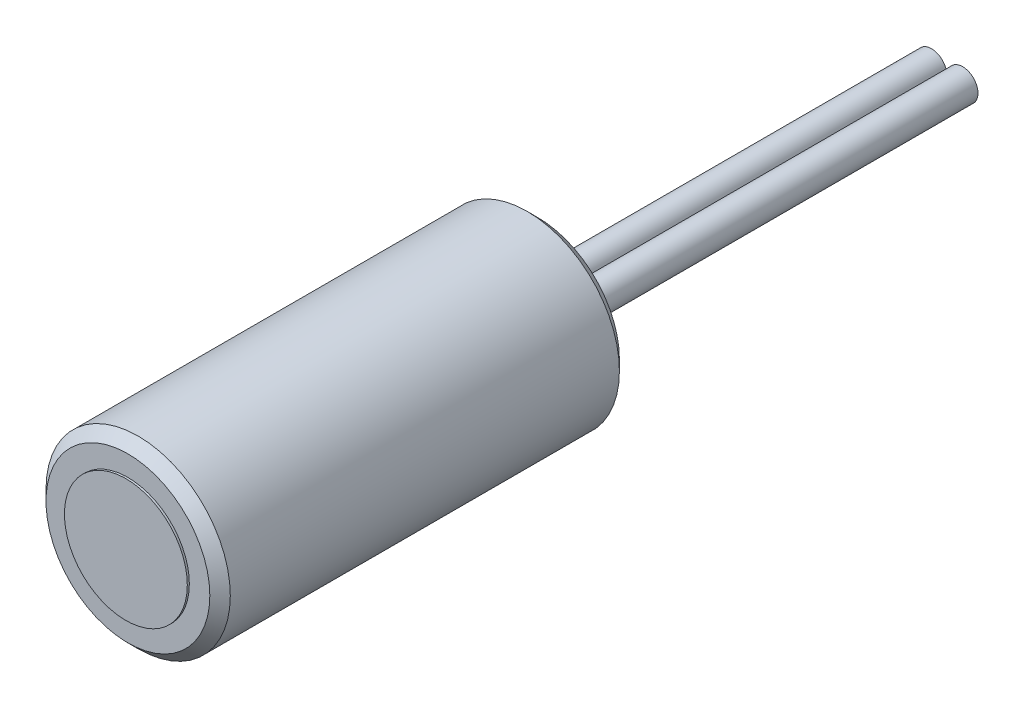
ISO-10303-21;
HEADER;
FILE_DESCRIPTION(('STEP AP214'),'2;1');
FILE_NAME('part.step','',(''),(''),'','','');
FILE_SCHEMA(('AUTOMOTIVE_DESIGN { 1 0 10303 214 1 1 1 1 }'));
ENDSEC;
DATA;
#1=APPLICATION_CONTEXT('core data for automotive mechanical design processes');
#2=APPLICATION_PROTOCOL_DEFINITION('international standard','automotive_design',2000,#1);
#3=PRODUCT_CONTEXT('',#1,'mechanical');
#4=PRODUCT('Part','Part','',(#3));
#5=PRODUCT_RELATED_PRODUCT_CATEGORY('part','',(#4));
#6=PRODUCT_DEFINITION_FORMATION('','',#4);
#7=PRODUCT_DEFINITION_CONTEXT('part definition',#1,'design');
#8=PRODUCT_DEFINITION('design','',#6,#7);
#9=PRODUCT_DEFINITION_SHAPE('','',#8);
#10=(LENGTH_UNIT() NAMED_UNIT(*) SI_UNIT(.MILLI.,.METRE.));
#11=(NAMED_UNIT(*) PLANE_ANGLE_UNIT() SI_UNIT($,.RADIAN.));
#12=(NAMED_UNIT(*) SI_UNIT($,.STERADIAN.) SOLID_ANGLE_UNIT());
#13=UNCERTAINTY_MEASURE_WITH_UNIT(LENGTH_MEASURE(1.E-05),#10,'distance_accuracy_value','');
#14=(GEOMETRIC_REPRESENTATION_CONTEXT(3) GLOBAL_UNCERTAINTY_ASSIGNED_CONTEXT((#13)) GLOBAL_UNIT_ASSIGNED_CONTEXT((#10,
#11,#12)) REPRESENTATION_CONTEXT('',''));
#15=CARTESIAN_POINT('',(0.,0.,0.));
#16=DIRECTION('',(0.,0.,1.));
#17=DIRECTION('',(1.,0.,0.));
#18=AXIS2_PLACEMENT_3D('',#15,#16,#17);
#19=CARTESIAN_POINT('',(0.,0.,0.));
#20=DIRECTION('',(0.,0.,1.));
#21=DIRECTION('',(1.,0.,0.));
#22=AXIS2_PLACEMENT_3D('',#19,#20,#21);
#23=PLANE('',#22);
#24=CARTESIAN_POINT('',(-0.76,0.,0.));
#25=DIRECTION('',(0.,0.,1.));
#26=DIRECTION('',(1.,0.,0.));
#27=AXIS2_PLACEMENT_3D('',#24,#25,#26);
#28=CIRCLE('',#27,0.75);
#29=CARTESIAN_POINT('',(-0.00999999999999992,0.,0.));
#30=VERTEX_POINT('',#29);
#31=EDGE_CURVE('E38',#30,#30,#28,.F.);
#32=ORIENTED_EDGE('',*,*,#31,.F.);
#33=EDGE_LOOP('',(#32));
#34=FACE_BOUND('',#33,.T.);
#35=CARTESIAN_POINT('',(0.,0.,0.));
#36=DIRECTION('',(0.,0.,1.));
#37=DIRECTION('',(1.,0.,0.));
#38=AXIS2_PLACEMENT_3D('',#35,#36,#37);
#39=CIRCLE('',#38,4.);
#40=CARTESIAN_POINT('',(4.,0.,0.));
#41=VERTEX_POINT('',#40);
#42=EDGE_CURVE('E46',#41,#41,#39,.F.);
#43=ORIENTED_EDGE('',*,*,#42,.T.);
#44=EDGE_LOOP('',(#43));
#45=FACE_BOUND('',#44,.T.);
#46=CARTESIAN_POINT('',(0.76,0.,0.));
#47=DIRECTION('',(0.,0.,1.));
#48=DIRECTION('',(1.,0.,0.));
#49=AXIS2_PLACEMENT_3D('',#46,#47,#48);
#50=CIRCLE('',#49,0.75);
#51=CARTESIAN_POINT('',(1.51,0.,0.));
#52=VERTEX_POINT('',#51);
#53=EDGE_CURVE('E10',#52,#52,#50,.F.);
#54=ORIENTED_EDGE('',*,*,#53,.F.);
#55=EDGE_LOOP('',(#54));
#56=FACE_BOUND('',#55,.T.);
#57=ADVANCED_FACE('F31',(#34,#45,#56),#23,.F.);
#58=CARTESIAN_POINT('',(0.,0.,20.));
#59=DIRECTION('',(0.,0.,1.));
#60=DIRECTION('',(1.,0.,0.));
#61=AXIS2_PLACEMENT_3D('',#58,#59,#60);
#62=PLANE('',#61);
#63=CARTESIAN_POINT('',(0.,0.,20.));
#64=DIRECTION('',(0.,0.,1.));
#65=DIRECTION('',(1.,0.,0.));
#66=AXIS2_PLACEMENT_3D('',#63,#64,#65);
#67=CIRCLE('',#66,4.);
#68=CARTESIAN_POINT('',(4.,0.,20.));
#69=VERTEX_POINT('',#68);
#70=EDGE_CURVE('E42',#69,#69,#67,.T.);
#71=ORIENTED_EDGE('',*,*,#70,.T.);
#72=EDGE_LOOP('',(#71));
#73=FACE_BOUND('',#72,.T.);
#74=CARTESIAN_POINT('',(0.,0.,20.));
#75=DIRECTION('',(0.,0.,1.));
#76=DIRECTION('',(1.,0.,0.));
#77=AXIS2_PLACEMENT_3D('',#74,#75,#76);
#78=CIRCLE('',#77,3.);
#79=CARTESIAN_POINT('',(3.,0.,20.));
#80=VERTEX_POINT('',#79);
#81=EDGE_CURVE('E58',#80,#80,#78,.T.);
#82=ORIENTED_EDGE('',*,*,#81,.F.);
#83=EDGE_LOOP('',(#82));
#84=FACE_BOUND('',#83,.T.);
#85=ADVANCED_FACE('F85',(#73,#84),#62,.T.);
#86=CARTESIAN_POINT('',(0.,0.,20.));
#87=DIRECTION('',(0.,0.,-1.));
#88=DIRECTION('',(-1.,0.,0.));
#89=AXIS2_PLACEMENT_3D('',#86,#87,#88);
#90=CYLINDRICAL_SURFACE('',#89,4.5);
#91=CARTESIAN_POINT('',(0.,0.,0.5));
#92=DIRECTION('',(0.,0.,1.));
#93=DIRECTION('',(1.,0.,0.));
#94=AXIS2_PLACEMENT_3D('',#91,#92,#93);
#95=CIRCLE('',#94,4.5);
#96=CARTESIAN_POINT('',(4.5,0.,0.5));
#97=VERTEX_POINT('',#96);
#98=EDGE_CURVE('E51',#97,#97,#95,.T.);
#99=ORIENTED_EDGE('',*,*,#98,.T.);
#100=EDGE_LOOP('',(#99));
#101=FACE_BOUND('',#100,.T.);
#102=CARTESIAN_POINT('',(0.,0.,19.5));
#103=DIRECTION('',(0.,0.,1.));
#104=DIRECTION('',(1.,0.,0.));
#105=AXIS2_PLACEMENT_3D('',#102,#103,#104);
#106=CIRCLE('',#105,4.5);
#107=CARTESIAN_POINT('',(4.5,0.,19.5));
#108=VERTEX_POINT('',#107);
#109=EDGE_CURVE('E54',#108,#108,#106,.F.);
#110=ORIENTED_EDGE('',*,*,#109,.T.);
#111=EDGE_LOOP('',(#110));
#112=FACE_BOUND('',#111,.T.);
#113=ADVANCED_FACE('F93',(#101,#112),#90,.T.);
#114=CARTESIAN_POINT('',(0.,0.,0.5));
#115=DIRECTION('',(0.,0.,1.));
#116=DIRECTION('',(1.,0.,0.));
#117=AXIS2_PLACEMENT_3D('',#114,#115,#116);
#118=CONICAL_SURFACE('',#117,4.5,0.785398163397449);
#119=ORIENTED_EDGE('',*,*,#42,.F.);
#120=EDGE_LOOP('',(#119));
#121=FACE_BOUND('',#120,.T.);
#122=ORIENTED_EDGE('',*,*,#98,.F.);
#123=EDGE_LOOP('',(#122));
#124=FACE_BOUND('',#123,.T.);
#125=ADVANCED_FACE('F100',(#121,#124),#118,.T.);
#126=CARTESIAN_POINT('',(0.,0.,20.));
#127=DIRECTION('',(0.,0.,-1.));
#128=DIRECTION('',(-1.,0.,0.));
#129=AXIS2_PLACEMENT_3D('',#126,#127,#128);
#130=CONICAL_SURFACE('',#129,4.,0.785398163397444);
#131=ORIENTED_EDGE('',*,*,#109,.F.);
#132=EDGE_LOOP('',(#131));
#133=FACE_BOUND('',#132,.T.);
#134=ORIENTED_EDGE('',*,*,#70,.F.);
#135=EDGE_LOOP('',(#134));
#136=FACE_BOUND('',#135,.T.);
#137=ADVANCED_FACE('F33',(#133,#136),#130,.T.);
#138=CARTESIAN_POINT('',(0.,0.,20.1));
#139=DIRECTION('',(0.,0.,-1.));
#140=DIRECTION('',(-1.,0.,0.));
#141=AXIS2_PLACEMENT_3D('',#138,#139,#140);
#142=CYLINDRICAL_SURFACE('',#141,3.);
#143=CARTESIAN_POINT('',(0.,0.,20.1));
#144=DIRECTION('',(0.,0.,1.));
#145=DIRECTION('',(1.,0.,0.));
#146=AXIS2_PLACEMENT_3D('',#143,#144,#145);
#147=CIRCLE('',#146,3.);
#148=CARTESIAN_POINT('',(3.,0.,20.1));
#149=VERTEX_POINT('',#148);
#150=EDGE_CURVE('E57',#149,#149,#147,.T.);
#151=ORIENTED_EDGE('',*,*,#150,.F.);
#152=EDGE_LOOP('',(#151));
#153=FACE_BOUND('',#152,.T.);
#154=ORIENTED_EDGE('',*,*,#81,.T.);
#155=EDGE_LOOP('',(#154));
#156=FACE_BOUND('',#155,.T.);
#157=ADVANCED_FACE('F107',(#153,#156),#142,.T.);
#158=CARTESIAN_POINT('',(0.,0.,20.1));
#159=DIRECTION('',(0.,0.,1.));
#160=DIRECTION('',(1.,0.,0.));
#161=AXIS2_PLACEMENT_3D('',#158,#159,#160);
#162=PLANE('',#161);
#163=ORIENTED_EDGE('',*,*,#150,.T.);
#164=EDGE_LOOP('',(#163));
#165=FACE_BOUND('',#164,.T.);
#166=ADVANCED_FACE('F120',(#165),#162,.T.);
#167=CARTESIAN_POINT('',(-0.76,0.,-20.));
#168=DIRECTION('',(0.,0.,1.));
#169=DIRECTION('',(1.,0.,0.));
#170=AXIS2_PLACEMENT_3D('',#167,#168,#169);
#171=CYLINDRICAL_SURFACE('',#170,0.75);
#172=CARTESIAN_POINT('',(-0.76,0.,-20.));
#173=DIRECTION('',(0.,0.,-1.));
#174=DIRECTION('',(-1.,0.,0.));
#175=AXIS2_PLACEMENT_3D('',#172,#173,#174);
#176=CIRCLE('',#175,0.75);
#177=CARTESIAN_POINT('',(-1.51,0.,-20.));
#178=VERTEX_POINT('',#177);
#179=EDGE_CURVE('E61',#178,#178,#176,.T.);
#180=ORIENTED_EDGE('',*,*,#179,.F.);
#181=EDGE_LOOP('',(#180));
#182=FACE_BOUND('',#181,.T.);
#183=ORIENTED_EDGE('',*,*,#31,.T.);
#184=EDGE_LOOP('',(#183));
#185=FACE_BOUND('',#184,.T.);
#186=ADVANCED_FACE('F81',(#182,#185),#171,.T.);
#187=CARTESIAN_POINT('',(-0.76,0.,-20.));
#188=DIRECTION('',(0.,0.,-1.));
#189=DIRECTION('',(-1.,0.,0.));
#190=AXIS2_PLACEMENT_3D('',#187,#188,#189);
#191=PLANE('',#190);
#192=ORIENTED_EDGE('',*,*,#179,.T.);
#193=EDGE_LOOP('',(#192));
#194=FACE_BOUND('',#193,.T.);
#195=ADVANCED_FACE('F74',(#194),#191,.T.);
#196=CARTESIAN_POINT('',(0.76,0.,-20.));
#197=DIRECTION('',(0.,0.,1.));
#198=DIRECTION('',(1.,0.,0.));
#199=AXIS2_PLACEMENT_3D('',#196,#197,#198);
#200=CYLINDRICAL_SURFACE('',#199,0.75);
#201=CARTESIAN_POINT('',(0.76,0.,-20.));
#202=DIRECTION('',(0.,0.,-1.));
#203=DIRECTION('',(-1.,0.,0.));
#204=AXIS2_PLACEMENT_3D('',#201,#202,#203);
#205=CIRCLE('',#204,0.75);
#206=CARTESIAN_POINT('',(0.00999999999999992,0.,-20.));
#207=VERTEX_POINT('',#206);
#208=EDGE_CURVE('E66',#207,#207,#205,.T.);
#209=ORIENTED_EDGE('',*,*,#208,.F.);
#210=EDGE_LOOP('',(#209));
#211=FACE_BOUND('',#210,.T.);
#212=ORIENTED_EDGE('',*,*,#53,.T.);
#213=EDGE_LOOP('',(#212));
#214=FACE_BOUND('',#213,.T.);
#215=ADVANCED_FACE('F72',(#211,#214),#200,.T.);
#216=CARTESIAN_POINT('',(0.76,0.,-20.));
#217=DIRECTION('',(0.,0.,-1.));
#218=DIRECTION('',(-1.,0.,0.));
#219=AXIS2_PLACEMENT_3D('',#216,#217,#218);
#220=PLANE('',#219);
#221=ORIENTED_EDGE('',*,*,#208,.T.);
#222=EDGE_LOOP('',(#221));
#223=FACE_BOUND('',#222,.T.);
#224=ADVANCED_FACE('F70',(#223),#220,.T.);
#225=CLOSED_SHELL('',(#57,#85,#113,#125,#137,#157,#166,#186,#195,#215,#224));
#226=MANIFOLD_SOLID_BREP('B2',#225);
#227=ADVANCED_BREP_SHAPE_REPRESENTATION('',(#18,#226),#14);
#228=SHAPE_DEFINITION_REPRESENTATION(#9,#227);
ENDSEC;
END-ISO-10303-21;
